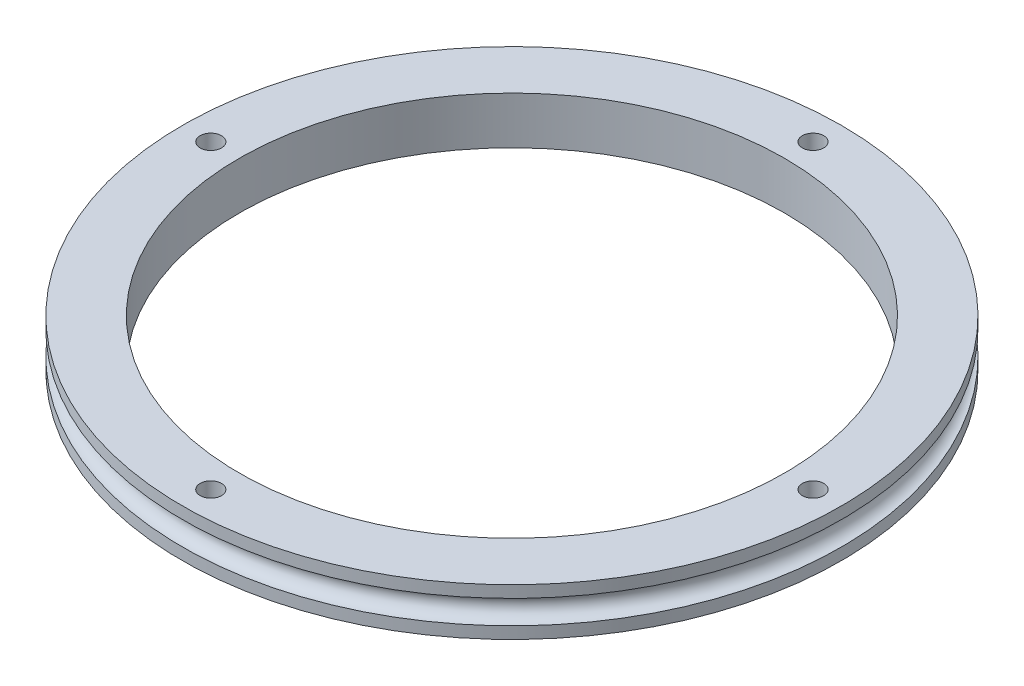
ISO-10303-21;
HEADER;
FILE_DESCRIPTION(('STEP AP214'),'2;1');
FILE_NAME('part.step','',(''),(''),'','','');
FILE_SCHEMA(('AUTOMOTIVE_DESIGN { 1 0 10303 214 1 1 1 1 }'));
ENDSEC;
DATA;
#1=APPLICATION_CONTEXT('core data for automotive mechanical design processes');
#2=APPLICATION_PROTOCOL_DEFINITION('international standard','automotive_design',2000,#1);
#3=PRODUCT_CONTEXT('',#1,'mechanical');
#4=PRODUCT('Part','Part','',(#3));
#5=PRODUCT_RELATED_PRODUCT_CATEGORY('part','',(#4));
#6=PRODUCT_DEFINITION_FORMATION('','',#4);
#7=PRODUCT_DEFINITION_CONTEXT('part definition',#1,'design');
#8=PRODUCT_DEFINITION('design','',#6,#7);
#9=PRODUCT_DEFINITION_SHAPE('','',#8);
#10=(LENGTH_UNIT() NAMED_UNIT(*) SI_UNIT(.MILLI.,.METRE.));
#11=(NAMED_UNIT(*) PLANE_ANGLE_UNIT() SI_UNIT($,.RADIAN.));
#12=(NAMED_UNIT(*) SI_UNIT($,.STERADIAN.) SOLID_ANGLE_UNIT());
#13=UNCERTAINTY_MEASURE_WITH_UNIT(LENGTH_MEASURE(1.E-05),#10,'distance_accuracy_value','');
#14=(GEOMETRIC_REPRESENTATION_CONTEXT(3) GLOBAL_UNCERTAINTY_ASSIGNED_CONTEXT((#13)) GLOBAL_UNIT_ASSIGNED_CONTEXT((#10,
#11,#12)) REPRESENTATION_CONTEXT('',''));
#15=CARTESIAN_POINT('',(0.,0.,0.));
#16=DIRECTION('',(0.,0.,1.));
#17=DIRECTION('',(1.,0.,0.));
#18=AXIS2_PLACEMENT_3D('',#15,#16,#17);
#19=CARTESIAN_POINT('',(0.,-5.61,0.));
#20=DIRECTION('',(0.,-1.,0.));
#21=DIRECTION('',(0.,0.,-1.));
#22=AXIS2_PLACEMENT_3D('',#19,#20,#21);
#23=CYLINDRICAL_SURFACE('',#22,69.5);
#24=CARTESIAN_POINT('',(0.,-5.00000000000001,0.));
#25=DIRECTION('',(0.,-1.,0.));
#26=DIRECTION('',(0.,0.,-1.));
#27=AXIS2_PLACEMENT_3D('',#24,#25,#26);
#28=CIRCLE('',#27,69.5);
#29=CARTESIAN_POINT('',(0.,-5.00000000000001,-69.5));
#30=VERTEX_POINT('',#29);
#31=EDGE_CURVE('E59',#30,#30,#28,.T.);
#32=ORIENTED_EDGE('',*,*,#31,.F.);
#33=EDGE_LOOP('',(#32));
#34=FACE_BOUND('',#33,.T.);
#35=CARTESIAN_POINT('',(0.,-2.5,0.));
#36=DIRECTION('',(0.,-1.,0.));
#37=DIRECTION('',(0.,0.,-1.));
#38=AXIS2_PLACEMENT_3D('',#35,#36,#37);
#39=CIRCLE('',#38,69.5);
#40=CARTESIAN_POINT('',(0.,-2.5,-69.5));
#41=VERTEX_POINT('',#40);
#42=EDGE_CURVE('E10',#41,#41,#39,.T.);
#43=ORIENTED_EDGE('',*,*,#42,.T.);
#44=EDGE_LOOP('',(#43));
#45=FACE_BOUND('',#44,.T.);
#46=ADVANCED_FACE('F37',(#34,#45),#23,.T.);
#47=CARTESIAN_POINT('',(0.,0.,0.));
#48=DIRECTION('',(0.,-1.,0.));
#49=DIRECTION('',(0.,0.,-1.));
#50=AXIS2_PLACEMENT_3D('',#47,#48,#49);
#51=TOROIDAL_SURFACE('',#50,69.5,2.5);
#52=ORIENTED_EDGE('',*,*,#42,.F.);
#53=EDGE_LOOP('',(#52));
#54=FACE_BOUND('',#53,.T.);
#55=CARTESIAN_POINT('',(0.,2.5,0.));
#56=DIRECTION('',(0.,-1.,0.));
#57=DIRECTION('',(0.,0.,-1.));
#58=AXIS2_PLACEMENT_3D('',#55,#56,#57);
#59=CIRCLE('',#58,69.5);
#60=CARTESIAN_POINT('',(0.,2.5,-69.5));
#61=VERTEX_POINT('',#60);
#62=EDGE_CURVE('E43',#61,#61,#59,.T.);
#63=ORIENTED_EDGE('',*,*,#62,.T.);
#64=EDGE_LOOP('',(#63));
#65=FACE_BOUND('',#64,.T.);
#66=ADVANCED_FACE('F118',(#54,#65),#51,.F.);
#67=CARTESIAN_POINT('',(0.,-5.61,0.));
#68=DIRECTION('',(0.,-1.,0.));
#69=DIRECTION('',(0.,0.,-1.));
#70=AXIS2_PLACEMENT_3D('',#67,#68,#69);
#71=CYLINDRICAL_SURFACE('',#70,69.5);
#72=ORIENTED_EDGE('',*,*,#62,.F.);
#73=EDGE_LOOP('',(#72));
#74=FACE_BOUND('',#73,.T.);
#75=CARTESIAN_POINT('',(0.,4.99999999999999,0.));
#76=DIRECTION('',(0.,-1.,0.));
#77=DIRECTION('',(0.,0.,-1.));
#78=AXIS2_PLACEMENT_3D('',#75,#76,#77);
#79=CIRCLE('',#78,69.5);
#80=CARTESIAN_POINT('',(0.,4.99999999999999,-69.5));
#81=VERTEX_POINT('',#80);
#82=EDGE_CURVE('E47',#81,#81,#79,.T.);
#83=ORIENTED_EDGE('',*,*,#82,.T.);
#84=EDGE_LOOP('',(#83));
#85=FACE_BOUND('',#84,.T.);
#86=ADVANCED_FACE('F122',(#74,#85),#71,.T.);
#87=CARTESIAN_POINT('',(-57.5,4.99999999999999,0.));
#88=DIRECTION('',(0.,-1.,0.));
#89=DIRECTION('',(0.,0.,-1.));
#90=AXIS2_PLACEMENT_3D('',#87,#88,#89);
#91=PLANE('',#90);
#92=CARTESIAN_POINT('',(2.21709065016539E-13,4.99999999999999,-63.5));
#93=DIRECTION('',(0.,-1.,0.));
#94=DIRECTION('',(1.,0.,0.));
#95=AXIS2_PLACEMENT_3D('',#92,#93,#94);
#96=CIRCLE('',#95,2.25);
#97=CARTESIAN_POINT('',(2.25000000000022,4.99999999999999,-63.5));
#98=VERTEX_POINT('',#97);
#99=EDGE_CURVE('E93',#98,#98,#96,.T.);
#100=ORIENTED_EDGE('',*,*,#99,.T.);
#101=EDGE_LOOP('',(#100));
#102=FACE_BOUND('',#101,.T.);
#103=CARTESIAN_POINT('',(63.5,4.99999999999999,0.));
#104=DIRECTION('',(0.,-1.,0.));
#105=DIRECTION('',(0.,0.,1.));
#106=AXIS2_PLACEMENT_3D('',#103,#104,#105);
#107=CIRCLE('',#106,2.25);
#108=CARTESIAN_POINT('',(63.5,4.99999999999999,2.25));
#109=VERTEX_POINT('',#108);
#110=EDGE_CURVE('E86',#109,#109,#107,.T.);
#111=ORIENTED_EDGE('',*,*,#110,.T.);
#112=EDGE_LOOP('',(#111));
#113=FACE_BOUND('',#112,.T.);
#114=CARTESIAN_POINT('',(-6.65127195049617E-13,4.99999999999999,63.5));
#115=DIRECTION('',(0.,-1.,0.));
#116=DIRECTION('',(-1.,0.,0.));
#117=AXIS2_PLACEMENT_3D('',#114,#115,#116);
#118=CIRCLE('',#117,2.25);
#119=CARTESIAN_POINT('',(-2.25000000000066,4.99999999999999,63.4999999999999));
#120=VERTEX_POINT('',#119);
#121=EDGE_CURVE('E76',#120,#120,#118,.T.);
#122=ORIENTED_EDGE('',*,*,#121,.T.);
#123=EDGE_LOOP('',(#122));
#124=FACE_BOUND('',#123,.T.);
#125=CARTESIAN_POINT('',(-63.5,4.99999999999999,0.));
#126=DIRECTION('',(0.,-1.,0.));
#127=DIRECTION('',(0.,0.,-1.));
#128=AXIS2_PLACEMENT_3D('',#125,#126,#127);
#129=CIRCLE('',#128,2.25);
#130=CARTESIAN_POINT('',(-63.5,4.99999999999999,-2.25));
#131=VERTEX_POINT('',#130);
#132=EDGE_CURVE('E62',#131,#131,#129,.T.);
#133=ORIENTED_EDGE('',*,*,#132,.T.);
#134=EDGE_LOOP('',(#133));
#135=FACE_BOUND('',#134,.T.);
#136=ORIENTED_EDGE('',*,*,#82,.F.);
#137=EDGE_LOOP('',(#136));
#138=FACE_BOUND('',#137,.T.);
#139=CARTESIAN_POINT('',(0.,4.99999999999999,0.));
#140=DIRECTION('',(0.,-1.,0.));
#141=DIRECTION('',(0.,0.,-1.));
#142=AXIS2_PLACEMENT_3D('',#139,#140,#141);
#143=CIRCLE('',#142,57.5);
#144=CARTESIAN_POINT('',(0.,4.99999999999999,-57.5));
#145=VERTEX_POINT('',#144);
#146=EDGE_CURVE('E51',#145,#145,#143,.T.);
#147=ORIENTED_EDGE('',*,*,#146,.T.);
#148=EDGE_LOOP('',(#147));
#149=FACE_BOUND('',#148,.T.);
#150=ADVANCED_FACE('F127',(#102,#113,#124,#135,#138,#149),#91,.F.);
#151=CARTESIAN_POINT('',(0.,-5.61,0.));
#152=DIRECTION('',(0.,-1.,0.));
#153=DIRECTION('',(0.,0.,-1.));
#154=AXIS2_PLACEMENT_3D('',#151,#152,#153);
#155=CYLINDRICAL_SURFACE('',#154,57.5);
#156=ORIENTED_EDGE('',*,*,#146,.F.);
#157=EDGE_LOOP('',(#156));
#158=FACE_BOUND('',#157,.T.);
#159=CARTESIAN_POINT('',(0.,-5.00000000000001,0.));
#160=DIRECTION('',(0.,-1.,0.));
#161=DIRECTION('',(0.,0.,-1.));
#162=AXIS2_PLACEMENT_3D('',#159,#160,#161);
#163=CIRCLE('',#162,57.5);
#164=CARTESIAN_POINT('',(0.,-5.00000000000001,-57.5));
#165=VERTEX_POINT('',#164);
#166=EDGE_CURVE('E56',#165,#165,#163,.T.);
#167=ORIENTED_EDGE('',*,*,#166,.T.);
#168=EDGE_LOOP('',(#167));
#169=FACE_BOUND('',#168,.T.);
#170=ADVANCED_FACE('F105',(#158,#169),#155,.F.);
#171=CARTESIAN_POINT('',(-57.5,-5.00000000000001,0.));
#172=DIRECTION('',(0.,1.,0.));
#173=DIRECTION('',(0.,0.,1.));
#174=AXIS2_PLACEMENT_3D('',#171,#172,#173);
#175=PLANE('',#174);
#176=CARTESIAN_POINT('',(2.21709065016539E-13,-5.00000000000001,-63.5));
#177=DIRECTION('',(0.,-1.,0.));
#178=DIRECTION('',(1.,0.,0.));
#179=AXIS2_PLACEMENT_3D('',#176,#177,#178);
#180=CIRCLE('',#179,4.7);
#181=CARTESIAN_POINT('',(4.70000000000022,-5.00000000000001,-63.5));
#182=VERTEX_POINT('',#181);
#183=EDGE_CURVE('E85',#182,#182,#180,.T.);
#184=ORIENTED_EDGE('',*,*,#183,.F.);
#185=EDGE_LOOP('',(#184));
#186=FACE_BOUND('',#185,.T.);
#187=CARTESIAN_POINT('',(63.5,-5.00000000000001,0.));
#188=DIRECTION('',(0.,-1.,0.));
#189=DIRECTION('',(0.,0.,1.));
#190=AXIS2_PLACEMENT_3D('',#187,#188,#189);
#191=CIRCLE('',#190,4.7);
#192=CARTESIAN_POINT('',(63.5,-5.00000000000001,4.7));
#193=VERTEX_POINT('',#192);
#194=EDGE_CURVE('E75',#193,#193,#191,.T.);
#195=ORIENTED_EDGE('',*,*,#194,.F.);
#196=EDGE_LOOP('',(#195));
#197=FACE_BOUND('',#196,.T.);
#198=CARTESIAN_POINT('',(-6.65127195049617E-13,-5.00000000000001,63.5));
#199=DIRECTION('',(0.,-1.,0.));
#200=DIRECTION('',(-1.,0.,0.));
#201=AXIS2_PLACEMENT_3D('',#198,#199,#200);
#202=CIRCLE('',#201,4.7);
#203=CARTESIAN_POINT('',(-4.70000000000066,-5.00000000000001,63.4999999999999));
#204=VERTEX_POINT('',#203);
#205=EDGE_CURVE('E79',#204,#204,#202,.T.);
#206=ORIENTED_EDGE('',*,*,#205,.F.);
#207=EDGE_LOOP('',(#206));
#208=FACE_BOUND('',#207,.T.);
#209=CARTESIAN_POINT('',(-63.5,-5.00000000000001,0.));
#210=DIRECTION('',(0.,-1.,0.));
#211=DIRECTION('',(0.,0.,-1.));
#212=AXIS2_PLACEMENT_3D('',#209,#210,#211);
#213=CIRCLE('',#212,4.7);
#214=CARTESIAN_POINT('',(-63.5,-5.00000000000001,-4.7));
#215=VERTEX_POINT('',#214);
#216=EDGE_CURVE('E68',#215,#215,#213,.T.);
#217=ORIENTED_EDGE('',*,*,#216,.F.);
#218=EDGE_LOOP('',(#217));
#219=FACE_BOUND('',#218,.T.);
#220=ORIENTED_EDGE('',*,*,#166,.F.);
#221=EDGE_LOOP('',(#220));
#222=FACE_BOUND('',#221,.T.);
#223=ORIENTED_EDGE('',*,*,#31,.T.);
#224=EDGE_LOOP('',(#223));
#225=FACE_BOUND('',#224,.T.);
#226=ADVANCED_FACE('F101',(#186,#197,#208,#219,#222,#225),#175,.F.);
#227=CARTESIAN_POINT('',(-63.5,-5.00000000000001,0.));
#228=DIRECTION('',(0.,-1.,0.));
#229=DIRECTION('',(0.,0.,-1.));
#230=AXIS2_PLACEMENT_3D('',#227,#228,#229);
#231=CYLINDRICAL_SURFACE('',#230,2.24999999999999);
#232=ORIENTED_EDGE('',*,*,#132,.F.);
#233=EDGE_LOOP('',(#232));
#234=FACE_BOUND('',#233,.T.);
#235=CARTESIAN_POINT('',(-63.5,-2.55,0.));
#236=DIRECTION('',(0.,-1.,0.));
#237=DIRECTION('',(0.,0.,-1.));
#238=AXIS2_PLACEMENT_3D('',#235,#236,#237);
#239=CIRCLE('',#238,2.24999999999999);
#240=CARTESIAN_POINT('',(-63.5,-2.55,-2.24999999999999));
#241=VERTEX_POINT('',#240);
#242=EDGE_CURVE('E65',#241,#241,#239,.T.);
#243=ORIENTED_EDGE('',*,*,#242,.T.);
#244=EDGE_LOOP('',(#243));
#245=FACE_BOUND('',#244,.T.);
#246=ADVANCED_FACE('F104',(#234,#245),#231,.F.);
#247=CARTESIAN_POINT('',(-63.5,-5.00000000000001,0.));
#248=DIRECTION('',(0.,-1.,0.));
#249=DIRECTION('',(0.,0.,-1.));
#250=AXIS2_PLACEMENT_3D('',#247,#248,#249);
#251=CONICAL_SURFACE('',#250,4.7,0.785398163397448);
#252=ORIENTED_EDGE('',*,*,#242,.F.);
#253=EDGE_LOOP('',(#252));
#254=FACE_BOUND('',#253,.T.);
#255=ORIENTED_EDGE('',*,*,#216,.T.);
#256=EDGE_LOOP('',(#255));
#257=FACE_BOUND('',#256,.T.);
#258=ADVANCED_FACE('F139',(#254,#257),#251,.F.);
#259=CARTESIAN_POINT('',(-6.65127195049617E-13,-5.00000000000001,63.5));
#260=DIRECTION('',(0.,-1.,0.));
#261=DIRECTION('',(-1.,0.,0.));
#262=AXIS2_PLACEMENT_3D('',#259,#260,#261);
#263=CYLINDRICAL_SURFACE('',#262,2.24999999999999);
#264=ORIENTED_EDGE('',*,*,#121,.F.);
#265=EDGE_LOOP('',(#264));
#266=FACE_BOUND('',#265,.T.);
#267=CARTESIAN_POINT('',(-6.65127195049617E-13,-2.55,63.5));
#268=DIRECTION('',(0.,-1.,0.));
#269=DIRECTION('',(-1.,0.,0.));
#270=AXIS2_PLACEMENT_3D('',#267,#268,#269);
#271=CIRCLE('',#270,2.24999999999999);
#272=CARTESIAN_POINT('',(-2.25000000000065,-2.55,63.4999999999999));
#273=VERTEX_POINT('',#272);
#274=EDGE_CURVE('E72',#273,#273,#271,.T.);
#275=ORIENTED_EDGE('',*,*,#274,.T.);
#276=EDGE_LOOP('',(#275));
#277=FACE_BOUND('',#276,.T.);
#278=ADVANCED_FACE('F143',(#266,#277),#263,.F.);
#279=CARTESIAN_POINT('',(-6.65127195049617E-13,-5.00000000000001,63.5));
#280=DIRECTION('',(0.,-1.,0.));
#281=DIRECTION('',(-1.,0.,0.));
#282=AXIS2_PLACEMENT_3D('',#279,#280,#281);
#283=CONICAL_SURFACE('',#282,4.7,0.785398163397448);
#284=ORIENTED_EDGE('',*,*,#274,.F.);
#285=EDGE_LOOP('',(#284));
#286=FACE_BOUND('',#285,.T.);
#287=ORIENTED_EDGE('',*,*,#205,.T.);
#288=EDGE_LOOP('',(#287));
#289=FACE_BOUND('',#288,.T.);
#290=ADVANCED_FACE('F147',(#286,#289),#283,.F.);
#291=CARTESIAN_POINT('',(63.5,-5.00000000000001,0.));
#292=DIRECTION('',(0.,-1.,0.));
#293=DIRECTION('',(0.,0.,1.));
#294=AXIS2_PLACEMENT_3D('',#291,#292,#293);
#295=CYLINDRICAL_SURFACE('',#294,2.24999999999999);
#296=ORIENTED_EDGE('',*,*,#110,.F.);
#297=EDGE_LOOP('',(#296));
#298=FACE_BOUND('',#297,.T.);
#299=CARTESIAN_POINT('',(63.5,-2.55,0.));
#300=DIRECTION('',(0.,-1.,0.));
#301=DIRECTION('',(0.,0.,1.));
#302=AXIS2_PLACEMENT_3D('',#299,#300,#301);
#303=CIRCLE('',#302,2.24999999999999);
#304=CARTESIAN_POINT('',(63.5,-2.55,2.24999999999999));
#305=VERTEX_POINT('',#304);
#306=EDGE_CURVE('E82',#305,#305,#303,.T.);
#307=ORIENTED_EDGE('',*,*,#306,.T.);
#308=EDGE_LOOP('',(#307));
#309=FACE_BOUND('',#308,.T.);
#310=ADVANCED_FACE('F151',(#298,#309),#295,.F.);
#311=CARTESIAN_POINT('',(63.5,-5.00000000000001,0.));
#312=DIRECTION('',(0.,-1.,0.));
#313=DIRECTION('',(0.,0.,1.));
#314=AXIS2_PLACEMENT_3D('',#311,#312,#313);
#315=CONICAL_SURFACE('',#314,4.7,0.785398163397448);
#316=ORIENTED_EDGE('',*,*,#306,.F.);
#317=EDGE_LOOP('',(#316));
#318=FACE_BOUND('',#317,.T.);
#319=ORIENTED_EDGE('',*,*,#194,.T.);
#320=EDGE_LOOP('',(#319));
#321=FACE_BOUND('',#320,.T.);
#322=ADVANCED_FACE('F155',(#318,#321),#315,.F.);
#323=CARTESIAN_POINT('',(2.21709065016539E-13,-5.00000000000001,-63.5));
#324=DIRECTION('',(0.,-1.,0.));
#325=DIRECTION('',(1.,0.,0.));
#326=AXIS2_PLACEMENT_3D('',#323,#324,#325);
#327=CYLINDRICAL_SURFACE('',#326,2.24999999999999);
#328=ORIENTED_EDGE('',*,*,#99,.F.);
#329=EDGE_LOOP('',(#328));
#330=FACE_BOUND('',#329,.T.);
#331=CARTESIAN_POINT('',(2.21709065016539E-13,-2.55,-63.5));
#332=DIRECTION('',(0.,-1.,0.));
#333=DIRECTION('',(1.,0.,0.));
#334=AXIS2_PLACEMENT_3D('',#331,#332,#333);
#335=CIRCLE('',#334,2.24999999999999);
#336=CARTESIAN_POINT('',(2.25000000000021,-2.55,-63.5));
#337=VERTEX_POINT('',#336);
#338=EDGE_CURVE('E71',#337,#337,#335,.T.);
#339=ORIENTED_EDGE('',*,*,#338,.T.);
#340=EDGE_LOOP('',(#339));
#341=FACE_BOUND('',#340,.T.);
#342=ADVANCED_FACE('F159',(#330,#341),#327,.F.);
#343=CARTESIAN_POINT('',(2.21709065016539E-13,-5.00000000000001,-63.5));
#344=DIRECTION('',(0.,-1.,0.));
#345=DIRECTION('',(1.,0.,0.));
#346=AXIS2_PLACEMENT_3D('',#343,#344,#345);
#347=CONICAL_SURFACE('',#346,4.7,0.785398163397448);
#348=ORIENTED_EDGE('',*,*,#338,.F.);
#349=EDGE_LOOP('',(#348));
#350=FACE_BOUND('',#349,.T.);
#351=ORIENTED_EDGE('',*,*,#183,.T.);
#352=EDGE_LOOP('',(#351));
#353=FACE_BOUND('',#352,.T.);
#354=ADVANCED_FACE('F99',(#350,#353),#347,.F.);
#355=CLOSED_SHELL('',(#46,#66,#86,#150,#170,#226,#246,#258,#278,#290,#310,#322,#342,#354));
#356=MANIFOLD_SOLID_BREP('B2',#355);
#357=ADVANCED_BREP_SHAPE_REPRESENTATION('',(#18,#356),#14);
#358=SHAPE_DEFINITION_REPRESENTATION(#9,#357);
ENDSEC;
END-ISO-10303-21;
